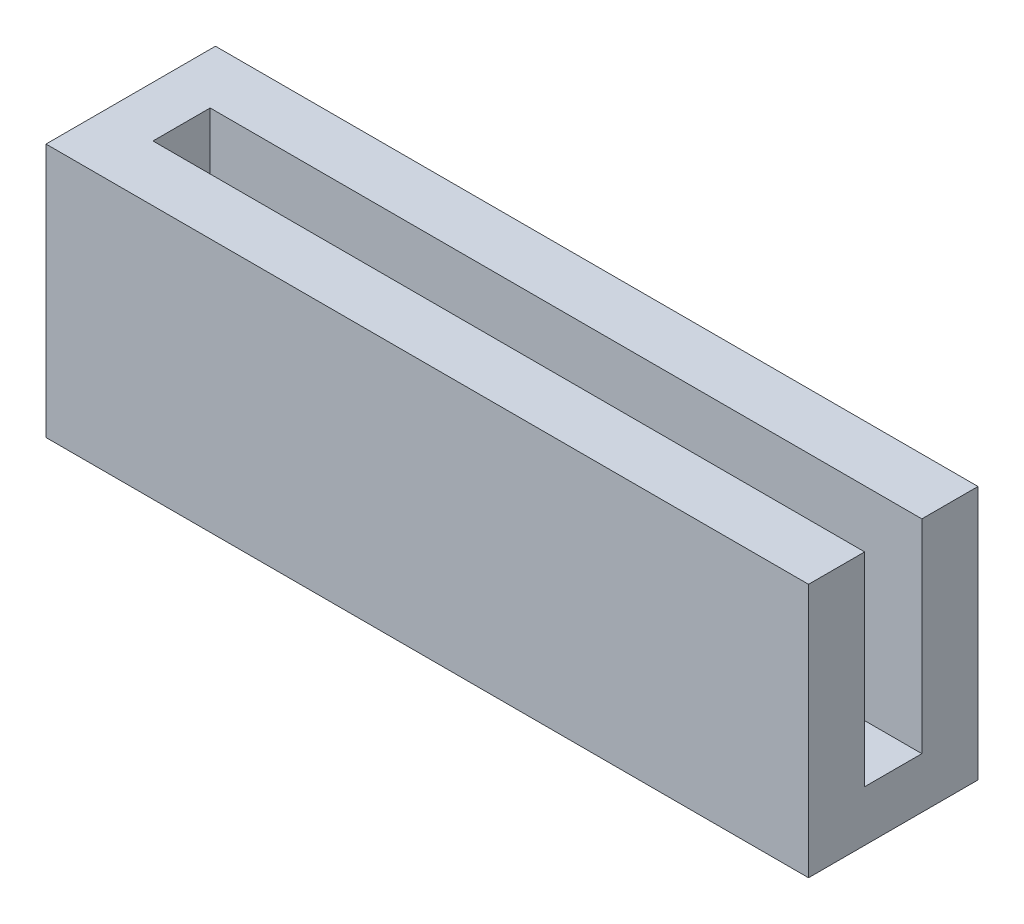
ISO-10303-21;
HEADER;
FILE_DESCRIPTION(('STEP AP214'),'2;1');
FILE_NAME('part.step','',(''),(''),'','','');
FILE_SCHEMA(('AUTOMOTIVE_DESIGN { 1 0 10303 214 1 1 1 1 }'));
ENDSEC;
DATA;
#1=APPLICATION_CONTEXT('core data for automotive mechanical design processes');
#2=APPLICATION_PROTOCOL_DEFINITION('international standard','automotive_design',2000,#1);
#3=PRODUCT_CONTEXT('',#1,'mechanical');
#4=PRODUCT('Part','Part','',(#3));
#5=PRODUCT_RELATED_PRODUCT_CATEGORY('part','',(#4));
#6=PRODUCT_DEFINITION_FORMATION('','',#4);
#7=PRODUCT_DEFINITION_CONTEXT('part definition',#1,'design');
#8=PRODUCT_DEFINITION('design','',#6,#7);
#9=PRODUCT_DEFINITION_SHAPE('','',#8);
#10=(LENGTH_UNIT() NAMED_UNIT(*) SI_UNIT(.MILLI.,.METRE.));
#11=(NAMED_UNIT(*) PLANE_ANGLE_UNIT() SI_UNIT($,.RADIAN.));
#12=(NAMED_UNIT(*) SI_UNIT($,.STERADIAN.) SOLID_ANGLE_UNIT());
#13=UNCERTAINTY_MEASURE_WITH_UNIT(LENGTH_MEASURE(1.E-05),#10,'distance_accuracy_value','');
#14=(GEOMETRIC_REPRESENTATION_CONTEXT(3) GLOBAL_UNCERTAINTY_ASSIGNED_CONTEXT((#13)) GLOBAL_UNIT_ASSIGNED_CONTEXT((#10,
#11,#12)) REPRESENTATION_CONTEXT('',''));
#15=CARTESIAN_POINT('',(0.,0.,0.));
#16=DIRECTION('',(0.,0.,1.));
#17=DIRECTION('',(1.,0.,0.));
#18=AXIS2_PLACEMENT_3D('',#15,#16,#17);
#19=CARTESIAN_POINT('',(0.,0.,5.));
#20=DIRECTION('',(1.,0.,0.));
#21=DIRECTION('',(0.,0.,-1.));
#22=AXIS2_PLACEMENT_3D('',#19,#20,#21);
#23=PLANE('',#22);
#24=DIRECTION('',(0.,-1.,0.));
#25=VECTOR('',#24,1.);
#26=CARTESIAN_POINT('',(0.,0.,-5.));
#27=LINE('',#26,#25);
#28=CARTESIAN_POINT('',(0.,15.,-5.));
#29=VERTEX_POINT('',#28);
#30=CARTESIAN_POINT('',(0.,0.,-5.));
#31=VERTEX_POINT('',#30);
#32=EDGE_CURVE('E158',#29,#31,#27,.T.);
#33=ORIENTED_EDGE('',*,*,#32,.T.);
#34=DIRECTION('',(0.,0.,-1.));
#35=VECTOR('',#34,1.);
#36=CARTESIAN_POINT('',(0.,0.,5.));
#37=LINE('',#36,#35);
#38=CARTESIAN_POINT('',(0.,0.,5.));
#39=VERTEX_POINT('',#38);
#40=EDGE_CURVE('E12',#39,#31,#37,.T.);
#41=ORIENTED_EDGE('',*,*,#40,.F.);
#42=DIRECTION('',(0.,-1.,0.));
#43=VECTOR('',#42,1.);
#44=CARTESIAN_POINT('',(0.,0.,5.));
#45=LINE('',#44,#43);
#46=CARTESIAN_POINT('',(0.,15.,5.));
#47=VERTEX_POINT('',#46);
#48=EDGE_CURVE('E160',#47,#39,#45,.T.);
#49=ORIENTED_EDGE('',*,*,#48,.F.);
#50=DIRECTION('',(0.,0.,-1.));
#51=VECTOR('',#50,1.);
#52=CARTESIAN_POINT('',(0.,15.,5.));
#53=LINE('',#52,#51);
#54=EDGE_CURVE('E170',#47,#29,#53,.T.);
#55=ORIENTED_EDGE('',*,*,#54,.T.);
#56=EDGE_LOOP('',(#33,#41,#49,#55));
#57=FACE_BOUND('',#56,.T.);
#58=ADVANCED_FACE('F47',(#57),#23,.F.);
#59=CARTESIAN_POINT('',(0.,0.,5.));
#60=DIRECTION('',(0.,1.,0.));
#61=DIRECTION('',(0.,0.,1.));
#62=AXIS2_PLACEMENT_3D('',#59,#60,#61);
#63=PLANE('',#62);
#64=DIRECTION('',(1.,0.,0.));
#65=VECTOR('',#64,1.);
#66=CARTESIAN_POINT('',(0.,0.,-5.));
#67=LINE('',#66,#65);
#68=CARTESIAN_POINT('',(45.,0.,-5.));
#69=VERTEX_POINT('',#68);
#70=EDGE_CURVE('E174',#31,#69,#67,.T.);
#71=ORIENTED_EDGE('',*,*,#70,.T.);
#72=DIRECTION('',(0.,0.,-1.));
#73=VECTOR('',#72,1.);
#74=CARTESIAN_POINT('',(45.,0.,5.));
#75=LINE('',#74,#73);
#76=CARTESIAN_POINT('',(45.,0.,5.));
#77=VERTEX_POINT('',#76);
#78=EDGE_CURVE('E55',#77,#69,#75,.T.);
#79=ORIENTED_EDGE('',*,*,#78,.F.);
#80=DIRECTION('',(1.,0.,0.));
#81=VECTOR('',#80,1.);
#82=CARTESIAN_POINT('',(0.,0.,5.));
#83=LINE('',#82,#81);
#84=EDGE_CURVE('E98',#39,#77,#83,.T.);
#85=ORIENTED_EDGE('',*,*,#84,.F.);
#86=ORIENTED_EDGE('',*,*,#40,.T.);
#87=EDGE_LOOP('',(#71,#79,#85,#86));
#88=FACE_BOUND('',#87,.T.);
#89=ADVANCED_FACE('F223',(#88),#63,.F.);
#90=CARTESIAN_POINT('',(45.,0.,5.));
#91=DIRECTION('',(-1.,0.,0.));
#92=DIRECTION('',(0.,0.,1.));
#93=AXIS2_PLACEMENT_3D('',#90,#91,#92);
#94=PLANE('',#93);
#95=DIRECTION('',(0.,0.,1.));
#96=VECTOR('',#95,1.);
#97=CARTESIAN_POINT('',(45.,3.,1.6875));
#98=LINE('',#97,#96);
#99=CARTESIAN_POINT('',(45.,3.,-1.6875));
#100=VERTEX_POINT('',#99);
#101=CARTESIAN_POINT('',(45.,3.,1.6875));
#102=VERTEX_POINT('',#101);
#103=EDGE_CURVE('E159',#100,#102,#98,.T.);
#104=ORIENTED_EDGE('',*,*,#103,.T.);
#105=DIRECTION('',(0.,1.,0.));
#106=VECTOR('',#105,1.);
#107=CARTESIAN_POINT('',(45.,-42.1353844767079,1.6875));
#108=LINE('',#107,#106);
#109=CARTESIAN_POINT('',(45.,15.,1.6875));
#110=VERTEX_POINT('',#109);
#111=EDGE_CURVE('E147',#102,#110,#108,.T.);
#112=ORIENTED_EDGE('',*,*,#111,.T.);
#113=DIRECTION('',(0.,0.,-1.));
#114=VECTOR('',#113,1.);
#115=CARTESIAN_POINT('',(45.,15.,5.));
#116=LINE('',#115,#114);
#117=CARTESIAN_POINT('',(45.,15.,5.));
#118=VERTEX_POINT('',#117);
#119=EDGE_CURVE('E186',#118,#110,#116,.T.);
#120=ORIENTED_EDGE('',*,*,#119,.F.);
#121=DIRECTION('',(0.,1.,0.));
#122=VECTOR('',#121,1.);
#123=CARTESIAN_POINT('',(45.,0.,5.));
#124=LINE('',#123,#122);
#125=EDGE_CURVE('E165',#77,#118,#124,.T.);
#126=ORIENTED_EDGE('',*,*,#125,.F.);
#127=ORIENTED_EDGE('',*,*,#78,.T.);
#128=DIRECTION('',(0.,1.,0.));
#129=VECTOR('',#128,1.);
#130=CARTESIAN_POINT('',(45.,0.,-5.));
#131=LINE('',#130,#129);
#132=CARTESIAN_POINT('',(45.,15.,-5.));
#133=VERTEX_POINT('',#132);
#134=EDGE_CURVE('E177',#69,#133,#131,.T.);
#135=ORIENTED_EDGE('',*,*,#134,.T.);
#136=CARTESIAN_POINT('',(45.,15.,-1.6875));
#137=VERTEX_POINT('',#136);
#138=EDGE_CURVE('E185',#137,#133,#116,.T.);
#139=ORIENTED_EDGE('',*,*,#138,.F.);
#140=DIRECTION('',(0.,1.,0.));
#141=VECTOR('',#140,1.);
#142=CARTESIAN_POINT('',(45.,-42.1353844767079,-1.6875));
#143=LINE('',#142,#141);
#144=EDGE_CURVE('E62',#100,#137,#143,.T.);
#145=ORIENTED_EDGE('',*,*,#144,.F.);
#146=EDGE_LOOP('',(#104,#112,#120,#126,#127,#135,#139,#145));
#147=FACE_BOUND('',#146,.T.);
#148=ADVANCED_FACE('F194',(#147),#94,.F.);
#149=CARTESIAN_POINT('',(0.,15.,5.));
#150=DIRECTION('',(0.,-1.,0.));
#151=DIRECTION('',(0.,0.,-1.));
#152=AXIS2_PLACEMENT_3D('',#149,#150,#151);
#153=PLANE('',#152);
#154=ORIENTED_EDGE('',*,*,#119,.T.);
#155=DIRECTION('',(1.,0.,0.));
#156=VECTOR('',#155,1.);
#157=CARTESIAN_POINT('',(3.,15.,1.6875));
#158=LINE('',#157,#156);
#159=CARTESIAN_POINT('',(3.,15.,1.6875));
#160=VERTEX_POINT('',#159);
#161=EDGE_CURVE('E140',#160,#110,#158,.T.);
#162=ORIENTED_EDGE('',*,*,#161,.F.);
#163=DIRECTION('',(0.,0.,1.));
#164=VECTOR('',#163,1.);
#165=CARTESIAN_POINT('',(3.,15.,1.6875));
#166=LINE('',#165,#164);
#167=CARTESIAN_POINT('',(3.,15.,-1.6875));
#168=VERTEX_POINT('',#167);
#169=EDGE_CURVE('E125',#168,#160,#166,.T.);
#170=ORIENTED_EDGE('',*,*,#169,.F.);
#171=DIRECTION('',(-1.,0.,0.));
#172=VECTOR('',#171,1.);
#173=CARTESIAN_POINT('',(3.,15.,-1.6875));
#174=LINE('',#173,#172);
#175=EDGE_CURVE('E133',#137,#168,#174,.T.);
#176=ORIENTED_EDGE('',*,*,#175,.F.);
#177=ORIENTED_EDGE('',*,*,#138,.T.);
#178=DIRECTION('',(-1.,0.,0.));
#179=VECTOR('',#178,1.);
#180=CARTESIAN_POINT('',(0.,15.,-5.));
#181=LINE('',#180,#179);
#182=EDGE_CURVE('E91',#133,#29,#181,.T.);
#183=ORIENTED_EDGE('',*,*,#182,.T.);
#184=ORIENTED_EDGE('',*,*,#54,.F.);
#185=DIRECTION('',(-1.,0.,0.));
#186=VECTOR('',#185,1.);
#187=CARTESIAN_POINT('',(0.,15.,5.));
#188=LINE('',#187,#186);
#189=EDGE_CURVE('E71',#118,#47,#188,.T.);
#190=ORIENTED_EDGE('',*,*,#189,.F.);
#191=EDGE_LOOP('',(#154,#162,#170,#176,#177,#183,#184,#190));
#192=FACE_BOUND('',#191,.T.);
#193=ADVANCED_FACE('F139',(#192),#153,.F.);
#194=CARTESIAN_POINT('',(0.,0.,5.));
#195=DIRECTION('',(0.,0.,-1.));
#196=DIRECTION('',(-1.,0.,0.));
#197=AXIS2_PLACEMENT_3D('',#194,#195,#196);
#198=PLANE('',#197);
#199=ORIENTED_EDGE('',*,*,#48,.T.);
#200=ORIENTED_EDGE('',*,*,#84,.T.);
#201=ORIENTED_EDGE('',*,*,#125,.T.);
#202=ORIENTED_EDGE('',*,*,#189,.T.);
#203=EDGE_LOOP('',(#199,#200,#201,#202));
#204=FACE_BOUND('',#203,.T.);
#205=ADVANCED_FACE('F235',(#204),#198,.F.);
#206=CARTESIAN_POINT('',(0.,0.,-5.));
#207=DIRECTION('',(0.,0.,-1.));
#208=DIRECTION('',(-1.,0.,0.));
#209=AXIS2_PLACEMENT_3D('',#206,#207,#208);
#210=PLANE('',#209);
#211=ORIENTED_EDGE('',*,*,#32,.F.);
#212=ORIENTED_EDGE('',*,*,#182,.F.);
#213=ORIENTED_EDGE('',*,*,#134,.F.);
#214=ORIENTED_EDGE('',*,*,#70,.F.);
#215=EDGE_LOOP('',(#211,#212,#213,#214));
#216=FACE_BOUND('',#215,.T.);
#217=ADVANCED_FACE('F198',(#216),#210,.T.);
#218=CARTESIAN_POINT('',(3.,-42.1353844767079,1.6875));
#219=DIRECTION('',(0.,0.,1.));
#220=DIRECTION('',(1.,0.,0.));
#221=AXIS2_PLACEMENT_3D('',#218,#219,#220);
#222=PLANE('',#221);
#223=DIRECTION('',(-1.,0.,0.));
#224=VECTOR('',#223,1.);
#225=CARTESIAN_POINT('',(3.,3.,1.6875));
#226=LINE('',#225,#224);
#227=CARTESIAN_POINT('',(3.,3.,1.6875));
#228=VERTEX_POINT('',#227);
#229=EDGE_CURVE('E206',#102,#228,#226,.T.);
#230=ORIENTED_EDGE('',*,*,#229,.T.);
#231=DIRECTION('',(0.,1.,0.));
#232=VECTOR('',#231,1.);
#233=CARTESIAN_POINT('',(3.,-42.1353844767079,1.6875));
#234=LINE('',#233,#232);
#235=EDGE_CURVE('E131',#228,#160,#234,.T.);
#236=ORIENTED_EDGE('',*,*,#235,.T.);
#237=ORIENTED_EDGE('',*,*,#161,.T.);
#238=ORIENTED_EDGE('',*,*,#111,.F.);
#239=EDGE_LOOP('',(#230,#236,#237,#238));
#240=FACE_BOUND('',#239,.T.);
#241=ADVANCED_FACE('F205',(#240),#222,.F.);
#242=CARTESIAN_POINT('',(3.,-42.1353844767079,1.6875));
#243=DIRECTION('',(-1.,0.,0.));
#244=DIRECTION('',(0.,0.,1.));
#245=AXIS2_PLACEMENT_3D('',#242,#243,#244);
#246=PLANE('',#245);
#247=DIRECTION('',(0.,0.,-1.));
#248=VECTOR('',#247,1.);
#249=CARTESIAN_POINT('',(3.,3.,1.6875));
#250=LINE('',#249,#248);
#251=CARTESIAN_POINT('',(3.,3.,-1.6875));
#252=VERTEX_POINT('',#251);
#253=EDGE_CURVE('E128',#228,#252,#250,.T.);
#254=ORIENTED_EDGE('',*,*,#253,.T.);
#255=DIRECTION('',(0.,1.,0.));
#256=VECTOR('',#255,1.);
#257=CARTESIAN_POINT('',(3.,-42.1353844767079,-1.6875));
#258=LINE('',#257,#256);
#259=EDGE_CURVE('E121',#252,#168,#258,.T.);
#260=ORIENTED_EDGE('',*,*,#259,.T.);
#261=ORIENTED_EDGE('',*,*,#169,.T.);
#262=ORIENTED_EDGE('',*,*,#235,.F.);
#263=EDGE_LOOP('',(#254,#260,#261,#262));
#264=FACE_BOUND('',#263,.T.);
#265=ADVANCED_FACE('F122',(#264),#246,.F.);
#266=CARTESIAN_POINT('',(3.,-42.1353844767079,-1.6875));
#267=DIRECTION('',(0.,0.,-1.));
#268=DIRECTION('',(-1.,0.,0.));
#269=AXIS2_PLACEMENT_3D('',#266,#267,#268);
#270=PLANE('',#269);
#271=DIRECTION('',(1.,0.,0.));
#272=VECTOR('',#271,1.);
#273=CARTESIAN_POINT('',(3.,3.,-1.6875));
#274=LINE('',#273,#272);
#275=EDGE_CURVE('E155',#252,#100,#274,.T.);
#276=ORIENTED_EDGE('',*,*,#275,.T.);
#277=ORIENTED_EDGE('',*,*,#144,.T.);
#278=ORIENTED_EDGE('',*,*,#175,.T.);
#279=ORIENTED_EDGE('',*,*,#259,.F.);
#280=EDGE_LOOP('',(#276,#277,#278,#279));
#281=FACE_BOUND('',#280,.T.);
#282=ADVANCED_FACE('F134',(#281),#270,.F.);
#283=CARTESIAN_POINT('',(0.,3.,5.));
#284=DIRECTION('',(0.,1.,0.));
#285=DIRECTION('',(0.,0.,1.));
#286=AXIS2_PLACEMENT_3D('',#283,#284,#285);
#287=PLANE('',#286);
#288=ORIENTED_EDGE('',*,*,#103,.F.);
#289=ORIENTED_EDGE('',*,*,#275,.F.);
#290=ORIENTED_EDGE('',*,*,#253,.F.);
#291=ORIENTED_EDGE('',*,*,#229,.F.);
#292=EDGE_LOOP('',(#288,#289,#290,#291));
#293=FACE_BOUND('',#292,.T.);
#294=ADVANCED_FACE('F210',(#293),#287,.T.);
#295=CLOSED_SHELL('',(#58,#89,#148,#193,#205,#217,#241,#265,#282,#294));
#296=MANIFOLD_SOLID_BREP('B2',#295);
#297=ADVANCED_BREP_SHAPE_REPRESENTATION('',(#18,#296),#14);
#298=SHAPE_DEFINITION_REPRESENTATION(#9,#297);
ENDSEC;
END-ISO-10303-21;
